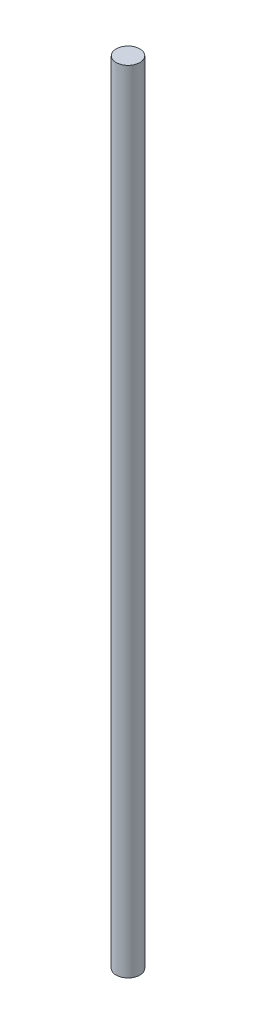
ISO-10303-21;
HEADER;
FILE_DESCRIPTION(('STEP AP214'),'2;1');
FILE_NAME('part.step','',(''),(''),'','','');
FILE_SCHEMA(('AUTOMOTIVE_DESIGN { 1 0 10303 214 1 1 1 1 }'));
ENDSEC;
DATA;
#1=APPLICATION_CONTEXT('core data for automotive mechanical design processes');
#2=APPLICATION_PROTOCOL_DEFINITION('international standard','automotive_design',2000,#1);
#3=PRODUCT_CONTEXT('',#1,'mechanical');
#4=PRODUCT('Part','Part','',(#3));
#5=PRODUCT_RELATED_PRODUCT_CATEGORY('part','',(#4));
#6=PRODUCT_DEFINITION_FORMATION('','',#4);
#7=PRODUCT_DEFINITION_CONTEXT('part definition',#1,'design');
#8=PRODUCT_DEFINITION('design','',#6,#7);
#9=PRODUCT_DEFINITION_SHAPE('','',#8);
#10=(LENGTH_UNIT() NAMED_UNIT(*) SI_UNIT(.MILLI.,.METRE.));
#11=(NAMED_UNIT(*) PLANE_ANGLE_UNIT() SI_UNIT($,.RADIAN.));
#12=(NAMED_UNIT(*) SI_UNIT($,.STERADIAN.) SOLID_ANGLE_UNIT());
#13=UNCERTAINTY_MEASURE_WITH_UNIT(LENGTH_MEASURE(1.E-05),#10,'distance_accuracy_value','');
#14=(GEOMETRIC_REPRESENTATION_CONTEXT(3) GLOBAL_UNCERTAINTY_ASSIGNED_CONTEXT((#13)) GLOBAL_UNIT_ASSIGNED_CONTEXT((#10,
#11,#12)) REPRESENTATION_CONTEXT('',''));
#15=CARTESIAN_POINT('',(0.,0.,0.));
#16=DIRECTION('',(0.,0.,1.));
#17=DIRECTION('',(1.,0.,0.));
#18=AXIS2_PLACEMENT_3D('',#15,#16,#17);
#19=CARTESIAN_POINT('',(0.,200.,0.));
#20=DIRECTION('',(0.,-1.,0.));
#21=DIRECTION('',(0.,0.,-1.));
#22=AXIS2_PLACEMENT_3D('',#19,#20,#21);
#23=CYLINDRICAL_SURFACE('',#22,3.);
#24=CARTESIAN_POINT('',(0.,200.,0.));
#25=DIRECTION('',(0.,1.,0.));
#26=DIRECTION('',(0.,0.,1.));
#27=AXIS2_PLACEMENT_3D('',#24,#25,#26);
#28=CIRCLE('',#27,3.);
#29=CARTESIAN_POINT('',(0.,200.,3.));
#30=VERTEX_POINT('',#29);
#31=EDGE_CURVE('E10',#30,#30,#28,.T.);
#32=ORIENTED_EDGE('',*,*,#31,.F.);
#33=EDGE_LOOP('',(#32));
#34=FACE_BOUND('',#33,.T.);
#35=CARTESIAN_POINT('',(0.,0.,0.));
#36=DIRECTION('',(0.,1.,0.));
#37=DIRECTION('',(0.,0.,1.));
#38=AXIS2_PLACEMENT_3D('',#35,#36,#37);
#39=CIRCLE('',#38,3.);
#40=CARTESIAN_POINT('',(0.,0.,3.));
#41=VERTEX_POINT('',#40);
#42=EDGE_CURVE('E37',#41,#41,#39,.T.);
#43=ORIENTED_EDGE('',*,*,#42,.T.);
#44=EDGE_LOOP('',(#43));
#45=FACE_BOUND('',#44,.T.);
#46=ADVANCED_FACE('F34',(#34,#45),#23,.T.);
#47=CARTESIAN_POINT('',(0.,200.,0.));
#48=DIRECTION('',(0.,1.,0.));
#49=DIRECTION('',(0.,0.,1.));
#50=AXIS2_PLACEMENT_3D('',#47,#48,#49);
#51=PLANE('',#50);
#52=ORIENTED_EDGE('',*,*,#31,.T.);
#53=EDGE_LOOP('',(#52));
#54=FACE_BOUND('',#53,.T.);
#55=ADVANCED_FACE('F49',(#54),#51,.T.);
#56=CARTESIAN_POINT('',(0.,0.,0.));
#57=DIRECTION('',(0.,1.,0.));
#58=DIRECTION('',(0.,0.,1.));
#59=AXIS2_PLACEMENT_3D('',#56,#57,#58);
#60=PLANE('',#59);
#61=ORIENTED_EDGE('',*,*,#42,.F.);
#62=EDGE_LOOP('',(#61));
#63=FACE_BOUND('',#62,.T.);
#64=ADVANCED_FACE('F47',(#63),#60,.F.);
#65=CLOSED_SHELL('',(#46,#55,#64));
#66=MANIFOLD_SOLID_BREP('B2',#65);
#67=ADVANCED_BREP_SHAPE_REPRESENTATION('',(#18,#66),#14);
#68=SHAPE_DEFINITION_REPRESENTATION(#9,#67);
ENDSEC;
END-ISO-10303-21;
